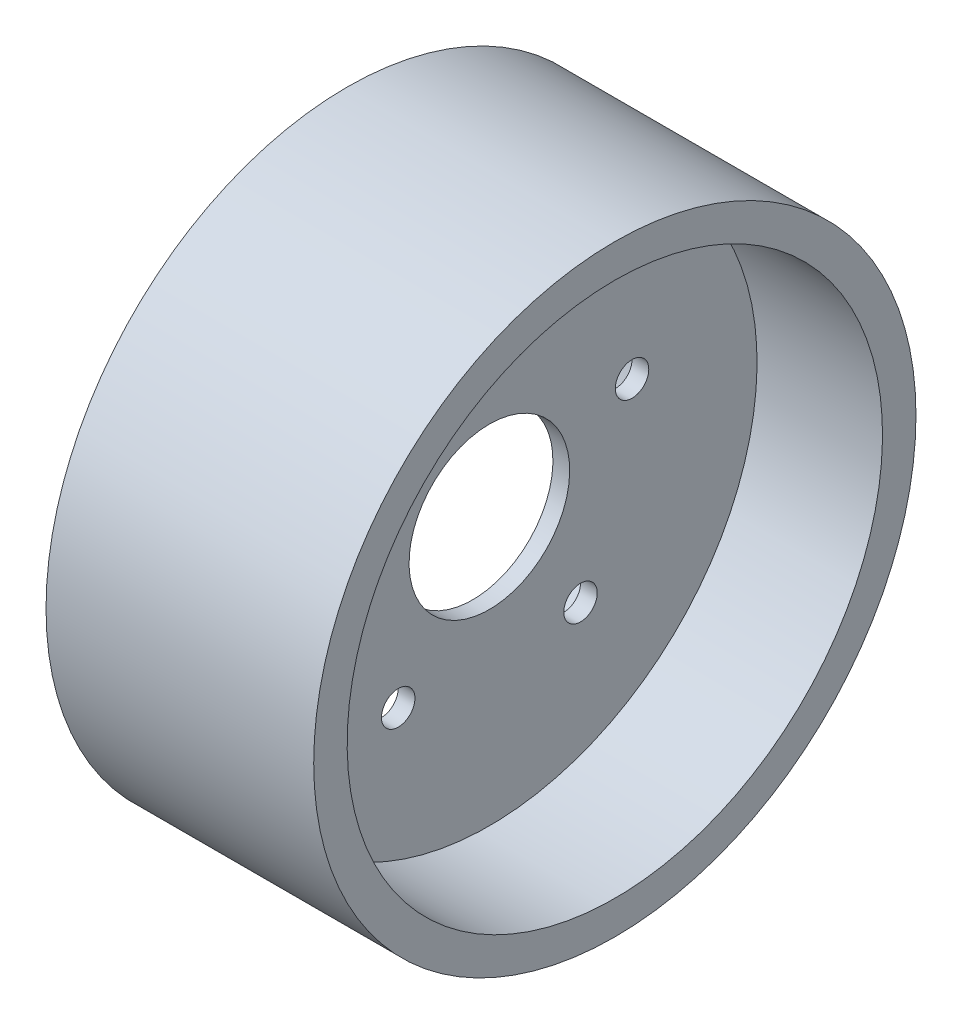
ISO-10303-21;
HEADER;
FILE_DESCRIPTION(('STEP AP214'),'2;1');
FILE_NAME('part.step','',(''),(''),'','','');
FILE_SCHEMA(('AUTOMOTIVE_DESIGN { 1 0 10303 214 1 1 1 1 }'));
ENDSEC;
DATA;
#1=APPLICATION_CONTEXT('core data for automotive mechanical design processes');
#2=APPLICATION_PROTOCOL_DEFINITION('international standard','automotive_design',2000,#1);
#3=PRODUCT_CONTEXT('',#1,'mechanical');
#4=PRODUCT('Part','Part','',(#3));
#5=PRODUCT_RELATED_PRODUCT_CATEGORY('part','',(#4));
#6=PRODUCT_DEFINITION_FORMATION('','',#4);
#7=PRODUCT_DEFINITION_CONTEXT('part definition',#1,'design');
#8=PRODUCT_DEFINITION('design','',#6,#7);
#9=PRODUCT_DEFINITION_SHAPE('','',#8);
#10=(LENGTH_UNIT() NAMED_UNIT(*) SI_UNIT(.MILLI.,.METRE.));
#11=(NAMED_UNIT(*) PLANE_ANGLE_UNIT() SI_UNIT($,.RADIAN.));
#12=(NAMED_UNIT(*) SI_UNIT($,.STERADIAN.) SOLID_ANGLE_UNIT());
#13=UNCERTAINTY_MEASURE_WITH_UNIT(LENGTH_MEASURE(1.E-05),#10,'distance_accuracy_value','');
#14=(GEOMETRIC_REPRESENTATION_CONTEXT(3) GLOBAL_UNCERTAINTY_ASSIGNED_CONTEXT((#13)) GLOBAL_UNIT_ASSIGNED_CONTEXT((#10,
#11,#12)) REPRESENTATION_CONTEXT('',''));
#15=CARTESIAN_POINT('',(0.,0.,0.));
#16=DIRECTION('',(0.,0.,1.));
#17=DIRECTION('',(1.,0.,0.));
#18=AXIS2_PLACEMENT_3D('',#15,#16,#17);
#19=CARTESIAN_POINT('',(6.34999999999997,0.,0.));
#20=DIRECTION('',(-1.,0.,0.));
#21=DIRECTION('',(0.,-1.,0.));
#22=AXIS2_PLACEMENT_3D('',#19,#20,#21);
#23=PLANE('',#22);
#24=CARTESIAN_POINT('',(6.34999999999998,18.25625,54.1556260783448));
#25=DIRECTION('',(1.,0.,0.));
#26=DIRECTION('',(0.,0.,-1.));
#27=AXIS2_PLACEMENT_3D('',#24,#25,#26);
#28=CIRCLE('',#27,6.35);
#29=CARTESIAN_POINT('',(6.34999999999998,18.25625,47.8056260783448));
#30=VERTEX_POINT('',#29);
#31=EDGE_CURVE('E108',#30,#30,#28,.T.);
#32=ORIENTED_EDGE('',*,*,#31,.F.);
#33=EDGE_LOOP('',(#32));
#34=FACE_BOUND('',#33,.T.);
#35=CARTESIAN_POINT('',(6.34999999999999,57.15,0.));
#36=DIRECTION('',(1.,0.,0.));
#37=DIRECTION('',(0.,0.,-1.));
#38=AXIS2_PLACEMENT_3D('',#35,#36,#37);
#39=CIRCLE('',#38,6.34999999999999);
#40=CARTESIAN_POINT('',(6.34999999999999,57.15,-6.34999999999999));
#41=VERTEX_POINT('',#40);
#42=EDGE_CURVE('E82',#41,#41,#39,.T.);
#43=ORIENTED_EDGE('',*,*,#42,.F.);
#44=EDGE_LOOP('',(#43));
#45=FACE_BOUND('',#44,.T.);
#46=CARTESIAN_POINT('',(6.34999999999998,18.25625,-54.1556260783448));
#47=DIRECTION('',(1.,0.,0.));
#48=DIRECTION('',(0.,0.,-1.));
#49=AXIS2_PLACEMENT_3D('',#46,#47,#48);
#50=CIRCLE('',#49,6.35);
#51=CARTESIAN_POINT('',(6.34999999999998,18.25625,-60.5056260783448));
#52=VERTEX_POINT('',#51);
#53=EDGE_CURVE('E81',#52,#52,#50,.T.);
#54=ORIENTED_EDGE('',*,*,#53,.F.);
#55=EDGE_LOOP('',(#54));
#56=FACE_BOUND('',#55,.T.);
#57=CARTESIAN_POINT('',(6.34999999999995,-45.4862847222222,-34.5994277722758));
#58=DIRECTION('',(1.,0.,0.));
#59=DIRECTION('',(0.,0.,-1.));
#60=AXIS2_PLACEMENT_3D('',#57,#58,#59);
#61=CIRCLE('',#60,6.35);
#62=CARTESIAN_POINT('',(6.34999999999995,-45.4862847222222,-40.9494277722758));
#63=VERTEX_POINT('',#62);
#64=EDGE_CURVE('E86',#63,#63,#61,.T.);
#65=ORIENTED_EDGE('',*,*,#64,.F.);
#66=EDGE_LOOP('',(#65));
#67=FACE_BOUND('',#66,.T.);
#68=CARTESIAN_POINT('',(6.34999999999995,-45.4862847222222,34.5994277722758));
#69=DIRECTION('',(1.,0.,0.));
#70=DIRECTION('',(0.,0.,-1.));
#71=AXIS2_PLACEMENT_3D('',#68,#69,#70);
#72=CIRCLE('',#71,6.35);
#73=CARTESIAN_POINT('',(6.34999999999995,-45.4862847222222,28.2494277722758));
#74=VERTEX_POINT('',#73);
#75=EDGE_CURVE('E69',#74,#74,#72,.T.);
#76=ORIENTED_EDGE('',*,*,#75,.F.);
#77=EDGE_LOOP('',(#76));
#78=FACE_BOUND('',#77,.T.);
#79=CARTESIAN_POINT('',(6.34999999999997,0.,0.));
#80=DIRECTION('',(1.,0.,0.));
#81=DIRECTION('',(0.,1.,0.));
#82=AXIS2_PLACEMENT_3D('',#79,#80,#81);
#83=CIRCLE('',#82,30.48);
#84=CARTESIAN_POINT('',(6.34999999999998,30.48,0.));
#85=VERTEX_POINT('',#84);
#86=EDGE_CURVE('E65',#85,#85,#83,.T.);
#87=ORIENTED_EDGE('',*,*,#86,.F.);
#88=EDGE_LOOP('',(#87));
#89=FACE_BOUND('',#88,.T.);
#90=CARTESIAN_POINT('',(6.34999999999994,0.,0.));
#91=DIRECTION('',(1.,0.,0.));
#92=DIRECTION('',(0.,1.,0.));
#93=AXIS2_PLACEMENT_3D('',#90,#91,#92);
#94=CIRCLE('',#93,101.6);
#95=CARTESIAN_POINT('',(6.34999999999998,101.6,0.));
#96=VERTEX_POINT('',#95);
#97=EDGE_CURVE('E11',#96,#96,#94,.T.);
#98=ORIENTED_EDGE('',*,*,#97,.T.);
#99=EDGE_LOOP('',(#98));
#100=FACE_BOUND('',#99,.T.);
#101=ADVANCED_FACE('F43',(#34,#45,#56,#67,#78,#89,#100),#23,.F.);
#102=CARTESIAN_POINT('',(6.35,0.,0.));
#103=DIRECTION('',(1.,0.,0.));
#104=DIRECTION('',(0.,1.,0.));
#105=AXIS2_PLACEMENT_3D('',#102,#103,#104);
#106=CYLINDRICAL_SURFACE('',#105,101.6);
#107=CARTESIAN_POINT('',(53.9749999999999,0.,0.));
#108=DIRECTION('',(1.,0.,0.));
#109=DIRECTION('',(0.,1.,0.));
#110=AXIS2_PLACEMENT_3D('',#107,#108,#109);
#111=CIRCLE('',#110,101.6);
#112=CARTESIAN_POINT('',(53.975,101.6,0.));
#113=VERTEX_POINT('',#112);
#114=EDGE_CURVE('E51',#113,#113,#111,.T.);
#115=ORIENTED_EDGE('',*,*,#114,.T.);
#116=EDGE_LOOP('',(#115));
#117=FACE_BOUND('',#116,.T.);
#118=ORIENTED_EDGE('',*,*,#97,.F.);
#119=EDGE_LOOP('',(#118));
#120=FACE_BOUND('',#119,.T.);
#121=ADVANCED_FACE('F129',(#117,#120),#106,.F.);
#122=CARTESIAN_POINT('',(53.9749999999999,0.,0.));
#123=DIRECTION('',(-1.,0.,0.));
#124=DIRECTION('',(0.,-1.,0.));
#125=AXIS2_PLACEMENT_3D('',#122,#123,#124);
#126=PLANE('',#125);
#127=ORIENTED_EDGE('',*,*,#114,.F.);
#128=EDGE_LOOP('',(#127));
#129=FACE_BOUND('',#128,.T.);
#130=CARTESIAN_POINT('',(53.9749999999999,0.,0.));
#131=DIRECTION('',(1.,0.,0.));
#132=DIRECTION('',(0.,1.,0.));
#133=AXIS2_PLACEMENT_3D('',#130,#131,#132);
#134=CIRCLE('',#133,114.3);
#135=CARTESIAN_POINT('',(53.975,114.3,0.));
#136=VERTEX_POINT('',#135);
#137=EDGE_CURVE('E56',#136,#136,#134,.T.);
#138=ORIENTED_EDGE('',*,*,#137,.T.);
#139=EDGE_LOOP('',(#138));
#140=FACE_BOUND('',#139,.T.);
#141=ADVANCED_FACE('F134',(#129,#140),#126,.F.);
#142=CARTESIAN_POINT('',(6.35,0.,0.));
#143=DIRECTION('',(1.,0.,0.));
#144=DIRECTION('',(0.,1.,0.));
#145=AXIS2_PLACEMENT_3D('',#142,#143,#144);
#146=CYLINDRICAL_SURFACE('',#145,114.3);
#147=ORIENTED_EDGE('',*,*,#137,.F.);
#148=EDGE_LOOP('',(#147));
#149=FACE_BOUND('',#148,.T.);
#150=CARTESIAN_POINT('',(-47.6250000000001,0.,0.));
#151=DIRECTION('',(1.,0.,0.));
#152=DIRECTION('',(0.,1.,0.));
#153=AXIS2_PLACEMENT_3D('',#150,#151,#152);
#154=CIRCLE('',#153,114.3);
#155=CARTESIAN_POINT('',(-47.625,114.3,0.));
#156=VERTEX_POINT('',#155);
#157=EDGE_CURVE('E90',#156,#156,#154,.T.);
#158=ORIENTED_EDGE('',*,*,#157,.T.);
#159=EDGE_LOOP('',(#158));
#160=FACE_BOUND('',#159,.T.);
#161=ADVANCED_FACE('F168',(#149,#160),#146,.T.);
#162=CARTESIAN_POINT('',(-47.6250000000001,0.,0.));
#163=DIRECTION('',(-1.,0.,0.));
#164=DIRECTION('',(0.,-1.,0.));
#165=AXIS2_PLACEMENT_3D('',#162,#163,#164);
#166=PLANE('',#165);
#167=CARTESIAN_POINT('',(-47.6250000000001,0.,0.));
#168=DIRECTION('',(1.,0.,0.));
#169=DIRECTION('',(0.,1.,0.));
#170=AXIS2_PLACEMENT_3D('',#167,#168,#169);
#171=CIRCLE('',#170,101.6);
#172=CARTESIAN_POINT('',(-47.625,101.6,0.));
#173=VERTEX_POINT('',#172);
#174=EDGE_CURVE('E93',#173,#173,#171,.T.);
#175=ORIENTED_EDGE('',*,*,#174,.T.);
#176=EDGE_LOOP('',(#175));
#177=FACE_BOUND('',#176,.T.);
#178=ORIENTED_EDGE('',*,*,#157,.F.);
#179=EDGE_LOOP('',(#178));
#180=FACE_BOUND('',#179,.T.);
#181=ADVANCED_FACE('F163',(#177,#180),#166,.T.);
#182=CARTESIAN_POINT('',(0.,0.,0.));
#183=DIRECTION('',(1.,0.,0.));
#184=DIRECTION('',(0.,1.,0.));
#185=AXIS2_PLACEMENT_3D('',#182,#183,#184);
#186=CIRCLE('',#185,101.6);
#187=CARTESIAN_POINT('',(0.,101.6,0.));
#188=VERTEX_POINT('',#187);
#189=EDGE_CURVE('E64',#188,#188,#186,.T.);
#190=ORIENTED_EDGE('',*,*,#189,.T.);
#191=EDGE_LOOP('',(#190));
#192=FACE_BOUND('',#191,.T.);
#193=ORIENTED_EDGE('',*,*,#174,.F.);
#194=EDGE_LOOP('',(#193));
#195=FACE_BOUND('',#194,.T.);
#196=ADVANCED_FACE('F137',(#192,#195),#106,.F.);
#197=CARTESIAN_POINT('',(0.,0.,0.));
#198=DIRECTION('',(1.,0.,0.));
#199=DIRECTION('',(0.,1.,0.));
#200=AXIS2_PLACEMENT_3D('',#197,#198,#199);
#201=PLANE('',#200);
#202=CARTESIAN_POINT('',(0.,18.25625,54.1556260783448));
#203=DIRECTION('',(1.,0.,0.));
#204=DIRECTION('',(0.,1.,0.));
#205=AXIS2_PLACEMENT_3D('',#202,#203,#204);
#206=CIRCLE('',#205,6.35);
#207=CARTESIAN_POINT('',(0.,24.60625,54.1556260783448));
#208=VERTEX_POINT('',#207);
#209=EDGE_CURVE('E46',#208,#208,#206,.T.);
#210=ORIENTED_EDGE('',*,*,#209,.T.);
#211=EDGE_LOOP('',(#210));
#212=FACE_BOUND('',#211,.T.);
#213=CARTESIAN_POINT('',(0.,57.15,0.));
#214=DIRECTION('',(1.,0.,0.));
#215=DIRECTION('',(0.,1.,0.));
#216=AXIS2_PLACEMENT_3D('',#213,#214,#215);
#217=CIRCLE('',#216,6.34999999999999);
#218=CARTESIAN_POINT('',(0.,63.5,0.));
#219=VERTEX_POINT('',#218);
#220=EDGE_CURVE('E78',#219,#219,#217,.T.);
#221=ORIENTED_EDGE('',*,*,#220,.T.);
#222=EDGE_LOOP('',(#221));
#223=FACE_BOUND('',#222,.T.);
#224=CARTESIAN_POINT('',(0.,18.25625,-54.1556260783448));
#225=DIRECTION('',(1.,0.,0.));
#226=DIRECTION('',(0.,1.,0.));
#227=AXIS2_PLACEMENT_3D('',#224,#225,#226);
#228=CIRCLE('',#227,6.35);
#229=CARTESIAN_POINT('',(0.,24.60625,-54.1556260783448));
#230=VERTEX_POINT('',#229);
#231=EDGE_CURVE('E83',#230,#230,#228,.T.);
#232=ORIENTED_EDGE('',*,*,#231,.T.);
#233=EDGE_LOOP('',(#232));
#234=FACE_BOUND('',#233,.T.);
#235=CARTESIAN_POINT('',(0.,-45.4862847222222,-34.5994277722758));
#236=DIRECTION('',(1.,0.,0.));
#237=DIRECTION('',(0.,1.,0.));
#238=AXIS2_PLACEMENT_3D('',#235,#236,#237);
#239=CIRCLE('',#238,6.35);
#240=CARTESIAN_POINT('',(0.,-39.1362847222222,-34.5994277722758));
#241=VERTEX_POINT('',#240);
#242=EDGE_CURVE('E70',#241,#241,#239,.T.);
#243=ORIENTED_EDGE('',*,*,#242,.T.);
#244=EDGE_LOOP('',(#243));
#245=FACE_BOUND('',#244,.T.);
#246=CARTESIAN_POINT('',(0.,-45.4862847222222,34.5994277722758));
#247=DIRECTION('',(1.,0.,0.));
#248=DIRECTION('',(0.,1.,0.));
#249=AXIS2_PLACEMENT_3D('',#246,#247,#248);
#250=CIRCLE('',#249,6.35);
#251=CARTESIAN_POINT('',(0.,-39.1362847222222,34.5994277722758));
#252=VERTEX_POINT('',#251);
#253=EDGE_CURVE('E66',#252,#252,#250,.T.);
#254=ORIENTED_EDGE('',*,*,#253,.T.);
#255=EDGE_LOOP('',(#254));
#256=FACE_BOUND('',#255,.T.);
#257=CARTESIAN_POINT('',(0.,0.,0.));
#258=DIRECTION('',(1.,0.,0.));
#259=DIRECTION('',(0.,1.,0.));
#260=AXIS2_PLACEMENT_3D('',#257,#258,#259);
#261=CIRCLE('',#260,30.48);
#262=CARTESIAN_POINT('',(0.,30.48,0.));
#263=VERTEX_POINT('',#262);
#264=EDGE_CURVE('E61',#263,#263,#261,.T.);
#265=ORIENTED_EDGE('',*,*,#264,.T.);
#266=EDGE_LOOP('',(#265));
#267=FACE_BOUND('',#266,.T.);
#268=ORIENTED_EDGE('',*,*,#189,.F.);
#269=EDGE_LOOP('',(#268));
#270=FACE_BOUND('',#269,.T.);
#271=ADVANCED_FACE('F115',(#212,#223,#234,#245,#256,#267,#270),#201,.F.);
#272=CARTESIAN_POINT('',(-47.6250000000001,0.,0.));
#273=DIRECTION('',(1.,0.,0.));
#274=DIRECTION('',(0.,1.,0.));
#275=AXIS2_PLACEMENT_3D('',#272,#273,#274);
#276=CYLINDRICAL_SURFACE('',#275,30.48);
#277=CARTESIAN_POINT('',(6.34999999999998,30.48,0.));
#278=CARTESIAN_POINT('',(6.28385416666665,30.48,0.));
#279=CARTESIAN_POINT('',(6.21770833333331,30.48,0.));
#280=CARTESIAN_POINT('',(6.08541666666665,30.48,0.));
#281=CARTESIAN_POINT('',(6.01927083333331,30.48,0.));
#282=CARTESIAN_POINT('',(5.88697916666665,30.48,0.));
#283=CARTESIAN_POINT('',(5.82083333333331,30.48,0.));
#284=CARTESIAN_POINT('',(5.68854166666665,30.48,0.));
#285=CARTESIAN_POINT('',(5.62239583333332,30.48,0.));
#286=CARTESIAN_POINT('',(5.49010416666665,30.48,0.));
#287=CARTESIAN_POINT('',(5.42395833333332,30.48,0.));
#288=CARTESIAN_POINT('',(5.29166666666665,30.48,0.));
#289=CARTESIAN_POINT('',(5.22552083333331,30.48,0.));
#290=CARTESIAN_POINT('',(5.09322916666665,30.48,0.));
#291=CARTESIAN_POINT('',(5.02708333333332,30.48,0.));
#292=CARTESIAN_POINT('',(4.89479166666665,30.48,0.));
#293=CARTESIAN_POINT('',(4.82864583333332,30.48,0.));
#294=CARTESIAN_POINT('',(4.69635416666665,30.48,0.));
#295=CARTESIAN_POINT('',(4.63020833333331,30.48,0.));
#296=CARTESIAN_POINT('',(4.49791666666665,30.48,0.));
#297=CARTESIAN_POINT('',(4.43177083333332,30.48,0.));
#298=CARTESIAN_POINT('',(4.29947916666665,30.48,0.));
#299=CARTESIAN_POINT('',(4.23333333333332,30.48,0.));
#300=CARTESIAN_POINT('',(4.10104166666665,30.48,0.));
#301=CARTESIAN_POINT('',(4.03489583333331,30.48,0.));
#302=CARTESIAN_POINT('',(3.90260416666665,30.48,0.));
#303=CARTESIAN_POINT('',(3.83645833333332,30.48,0.));
#304=CARTESIAN_POINT('',(3.70416666666665,30.48,0.));
#305=CARTESIAN_POINT('',(3.63802083333332,30.48,0.));
#306=CARTESIAN_POINT('',(3.50572916666665,30.48,0.));
#307=CARTESIAN_POINT('',(3.43958333333332,30.48,0.));
#308=CARTESIAN_POINT('',(3.30729166666665,30.48,0.));
#309=CARTESIAN_POINT('',(3.24114583333332,30.48,0.));
#310=CARTESIAN_POINT('',(3.10885416666665,30.48,0.));
#311=CARTESIAN_POINT('',(3.04270833333332,30.48,0.));
#312=CARTESIAN_POINT('',(2.91041666666665,30.48,0.));
#313=CARTESIAN_POINT('',(2.84427083333332,30.48,0.));
#314=CARTESIAN_POINT('',(2.71197916666665,30.48,0.));
#315=CARTESIAN_POINT('',(2.64583333333332,30.48,0.));
#316=CARTESIAN_POINT('',(2.51354166666665,30.48,0.));
#317=CARTESIAN_POINT('',(2.44739583333332,30.48,0.));
#318=CARTESIAN_POINT('',(2.31510416666665,30.48,0.));
#319=CARTESIAN_POINT('',(2.24895833333332,30.48,0.));
#320=CARTESIAN_POINT('',(2.11666666666665,30.48,0.));
#321=CARTESIAN_POINT('',(2.05052083333332,30.48,0.));
#322=CARTESIAN_POINT('',(1.91822916666665,30.48,0.));
#323=CARTESIAN_POINT('',(1.85208333333332,30.48,0.));
#324=CARTESIAN_POINT('',(1.71979166666665,30.48,0.));
#325=CARTESIAN_POINT('',(1.65364583333332,30.48,0.));
#326=CARTESIAN_POINT('',(1.52135416666665,30.48,0.));
#327=CARTESIAN_POINT('',(1.45520833333332,30.48,0.));
#328=CARTESIAN_POINT('',(1.32291666666665,30.48,0.));
#329=CARTESIAN_POINT('',(1.25677083333332,30.48,0.));
#330=CARTESIAN_POINT('',(1.12447916666665,30.48,0.));
#331=CARTESIAN_POINT('',(1.05833333333332,30.48,0.));
#332=CARTESIAN_POINT('',(0.92604166666665,30.48,0.));
#333=CARTESIAN_POINT('',(0.859895833333316,30.48,0.));
#334=CARTESIAN_POINT('',(0.72760416666665,30.48,0.));
#335=CARTESIAN_POINT('',(0.661458333333318,30.48,0.));
#336=CARTESIAN_POINT('',(0.529166666666652,30.48,0.));
#337=CARTESIAN_POINT('',(0.463020833333318,30.48,0.));
#338=CARTESIAN_POINT('',(0.330729166666652,30.48,0.));
#339=CARTESIAN_POINT('',(0.26458333333332,30.48,0.));
#340=CARTESIAN_POINT('',(0.132291666666654,30.48,0.));
#341=CARTESIAN_POINT('',(0.0661458333333203,30.48,0.));
#342=CARTESIAN_POINT('',(0.,30.48,0.));
#343=B_SPLINE_CURVE_WITH_KNOTS('',3,(#277,#278,#279,#280,#281,#282,#283,#284,#285,#286,#287,
#288,#289,#290,#291,#292,#293,#294,#295,#296,#297,#298,#299,#300,#301,#302,#303,#304,#305,#306,
#307,#308,#309,#310,#311,#312,#313,#314,#315,#316,#317,#318,#319,#320,#321,#322,#323,#324,#325,
#326,#327,#328,#329,#330,#331,#332,#333,#334,#335,#336,#337,#338,#339,#340,#341,#342),
.UNSPECIFIED.,.F.,.F.,(4,2,2,2,2,2,2,2,2,2,2,2,2,2,2,2,2,2,2,2,2,2,2,2,2,2,2,2,2,2,2,2,4),(0.,
0.198437500000002,0.396874999999998,0.5953125,0.793749999999996,0.992187499999998,1.190625,
1.3890625,1.5875,1.7859375,1.984375,2.1828125,2.38125,2.5796875,2.778125,2.97656249999999,3.175,
3.3734375,3.571875,3.7703125,3.96874999999999,4.1671875,4.365625,4.56406249999999,4.7625,
4.9609375,5.15937499999999,5.3578125,5.55625,5.75468749999999,5.953125,6.15156249999999,
6.34999999999999),.UNSPECIFIED.);
#344=EDGE_CURVE('BSEAM149',#85,#263,#343,.T.);
#345=ORIENTED_EDGE('',*,*,#86,.T.);
#346=ORIENTED_EDGE('',*,*,#264,.F.);
#347=ORIENTED_EDGE('',*,*,#344,.T.);
#348=ORIENTED_EDGE('',*,*,#344,.F.);
#349=EDGE_LOOP('',(#345,#347,#346,#348));
#350=FACE_BOUND('',#349,.T.);
#351=ADVANCED_FACE('F149',(#350),#276,.F.);
#352=CARTESIAN_POINT('',(6.34999999999995,-45.4862847222222,34.5994277722758));
#353=DIRECTION('',(1.,0.,0.));
#354=DIRECTION('',(0.,0.,-1.));
#355=AXIS2_PLACEMENT_3D('',#352,#353,#354);
#356=CYLINDRICAL_SURFACE('',#355,6.35);
#357=ORIENTED_EDGE('',*,*,#75,.T.);
#358=EDGE_LOOP('',(#357));
#359=FACE_BOUND('',#358,.T.);
#360=ORIENTED_EDGE('',*,*,#253,.F.);
#361=EDGE_LOOP('',(#360));
#362=FACE_BOUND('',#361,.T.);
#363=ADVANCED_FACE('F152',(#359,#362),#356,.F.);
#364=CARTESIAN_POINT('',(6.34999999999995,-45.4862847222222,-34.5994277722758));
#365=DIRECTION('',(1.,0.,0.));
#366=DIRECTION('',(0.,0.,-1.));
#367=AXIS2_PLACEMENT_3D('',#364,#365,#366);
#368=CYLINDRICAL_SURFACE('',#367,6.35);
#369=ORIENTED_EDGE('',*,*,#64,.T.);
#370=EDGE_LOOP('',(#369));
#371=FACE_BOUND('',#370,.T.);
#372=ORIENTED_EDGE('',*,*,#242,.F.);
#373=EDGE_LOOP('',(#372));
#374=FACE_BOUND('',#373,.T.);
#375=ADVANCED_FACE('F183',(#371,#374),#368,.F.);
#376=CARTESIAN_POINT('',(6.34999999999998,18.25625,-54.1556260783448));
#377=DIRECTION('',(1.,0.,0.));
#378=DIRECTION('',(0.,0.,-1.));
#379=AXIS2_PLACEMENT_3D('',#376,#377,#378);
#380=CYLINDRICAL_SURFACE('',#379,6.35);
#381=ORIENTED_EDGE('',*,*,#53,.T.);
#382=EDGE_LOOP('',(#381));
#383=FACE_BOUND('',#382,.T.);
#384=ORIENTED_EDGE('',*,*,#231,.F.);
#385=EDGE_LOOP('',(#384));
#386=FACE_BOUND('',#385,.T.);
#387=ADVANCED_FACE('F125',(#383,#386),#380,.F.);
#388=CARTESIAN_POINT('',(6.34999999999999,57.15,0.));
#389=DIRECTION('',(1.,0.,0.));
#390=DIRECTION('',(0.,0.,-1.));
#391=AXIS2_PLACEMENT_3D('',#388,#389,#390);
#392=CYLINDRICAL_SURFACE('',#391,6.34999999999999);
#393=ORIENTED_EDGE('',*,*,#42,.T.);
#394=EDGE_LOOP('',(#393));
#395=FACE_BOUND('',#394,.T.);
#396=ORIENTED_EDGE('',*,*,#220,.F.);
#397=EDGE_LOOP('',(#396));
#398=FACE_BOUND('',#397,.T.);
#399=ADVANCED_FACE('F120',(#395,#398),#392,.F.);
#400=CARTESIAN_POINT('',(6.34999999999998,18.25625,54.1556260783448));
#401=DIRECTION('',(1.,0.,0.));
#402=DIRECTION('',(0.,0.,-1.));
#403=AXIS2_PLACEMENT_3D('',#400,#401,#402);
#404=CYLINDRICAL_SURFACE('',#403,6.35);
#405=ORIENTED_EDGE('',*,*,#31,.T.);
#406=EDGE_LOOP('',(#405));
#407=FACE_BOUND('',#406,.T.);
#408=ORIENTED_EDGE('',*,*,#209,.F.);
#409=EDGE_LOOP('',(#408));
#410=FACE_BOUND('',#409,.T.);
#411=ADVANCED_FACE('F118',(#407,#410),#404,.F.);
#412=CLOSED_SHELL('',(#101,#121,#141,#161,#181,#196,#271,#351,#363,#375,#387,#399,#411));
#413=MANIFOLD_SOLID_BREP('B2',#412);
#414=ADVANCED_BREP_SHAPE_REPRESENTATION('',(#18,#413),#14);
#415=SHAPE_DEFINITION_REPRESENTATION(#9,#414);
ENDSEC;
END-ISO-10303-21;
